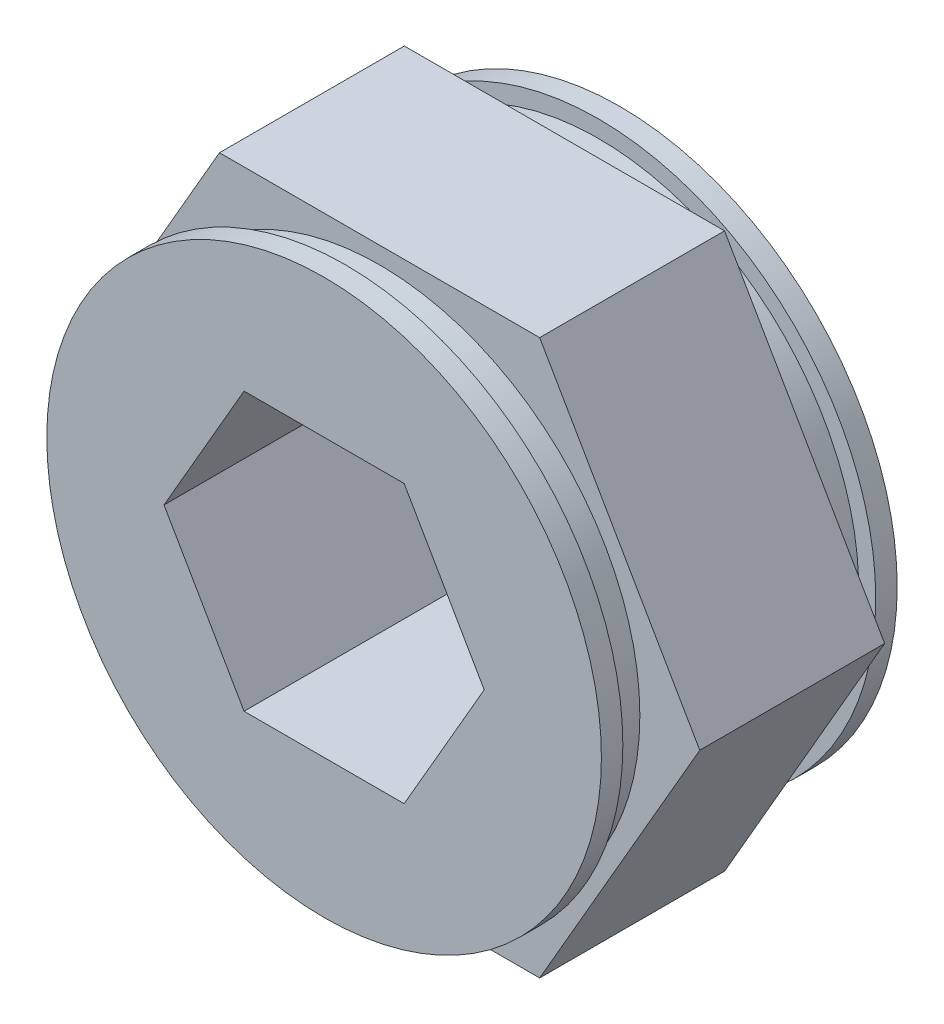
ISO-10303-21;
HEADER;
FILE_DESCRIPTION(('STEP AP214'),'2;1');
FILE_NAME('part.step','',(''),(''),'','','');
FILE_SCHEMA(('AUTOMOTIVE_DESIGN { 1 0 10303 214 1 1 1 1 }'));
ENDSEC;
DATA;
#1=APPLICATION_CONTEXT('core data for automotive mechanical design processes');
#2=APPLICATION_PROTOCOL_DEFINITION('international standard','automotive_design',2000,#1);
#3=PRODUCT_CONTEXT('',#1,'mechanical');
#4=PRODUCT('Part','Part','',(#3));
#5=PRODUCT_RELATED_PRODUCT_CATEGORY('part','',(#4));
#6=PRODUCT_DEFINITION_FORMATION('','',#4);
#7=PRODUCT_DEFINITION_CONTEXT('part definition',#1,'design');
#8=PRODUCT_DEFINITION('design','',#6,#7);
#9=PRODUCT_DEFINITION_SHAPE('','',#8);
#10=(LENGTH_UNIT() NAMED_UNIT(*) SI_UNIT(.MILLI.,.METRE.));
#11=(NAMED_UNIT(*) PLANE_ANGLE_UNIT() SI_UNIT($,.RADIAN.));
#12=(NAMED_UNIT(*) SI_UNIT($,.STERADIAN.) SOLID_ANGLE_UNIT());
#13=UNCERTAINTY_MEASURE_WITH_UNIT(LENGTH_MEASURE(1.E-05),#10,'distance_accuracy_value','');
#14=(GEOMETRIC_REPRESENTATION_CONTEXT(3) GLOBAL_UNCERTAINTY_ASSIGNED_CONTEXT((#13)) GLOBAL_UNIT_ASSIGNED_CONTEXT((#10,
#11,#12)) REPRESENTATION_CONTEXT('',''));
#15=CARTESIAN_POINT('',(0.,0.,0.));
#16=DIRECTION('',(0.,0.,1.));
#17=DIRECTION('',(1.,0.,0.));
#18=AXIS2_PLACEMENT_3D('',#15,#16,#17);
#19=CARTESIAN_POINT('',(0.,0.,0.));
#20=DIRECTION('',(0.,0.,1.));
#21=DIRECTION('',(1.,0.,0.));
#22=AXIS2_PLACEMENT_3D('',#19,#20,#21);
#23=PLANE('',#22);
#24=CARTESIAN_POINT('',(0.,0.,0.));
#25=DIRECTION('',(0.,0.,-1.));
#26=DIRECTION('',(-1.,0.,0.));
#27=AXIS2_PLACEMENT_3D('',#24,#25,#26);
#28=CIRCLE('',#27,8.9408);
#29=CARTESIAN_POINT('',(-8.9408,0.,0.));
#30=VERTEX_POINT('',#29);
#31=EDGE_CURVE('E20',#30,#30,#28,.T.);
#32=ORIENTED_EDGE('',*,*,#31,.F.);
#33=EDGE_LOOP('',(#32));
#34=FACE_BOUND('',#33,.T.);
#35=DIRECTION('',(0.5,0.866025403784438,0.));
#36=VECTOR('',#35,1.);
#37=CARTESIAN_POINT('',(5.49926131403117,-9.525,0.));
#38=LINE('',#37,#36);
#39=CARTESIAN_POINT('',(5.49926131403117,-9.525,0.));
#40=VERTEX_POINT('',#39);
#41=CARTESIAN_POINT('',(10.9985226280624,0.,0.));
#42=VERTEX_POINT('',#41);
#43=EDGE_CURVE('E179',#40,#42,#38,.T.);
#44=ORIENTED_EDGE('',*,*,#43,.F.);
#45=DIRECTION('',(1.,0.,0.));
#46=VECTOR('',#45,1.);
#47=CARTESIAN_POINT('',(-5.49926131403119,-9.525,0.));
#48=LINE('',#47,#46);
#49=CARTESIAN_POINT('',(-5.4992613140312,-9.525,0.));
#50=VERTEX_POINT('',#49);
#51=EDGE_CURVE('E184',#50,#40,#48,.T.);
#52=ORIENTED_EDGE('',*,*,#51,.F.);
#53=DIRECTION('',(0.5,-0.866025403784439,0.));
#54=VECTOR('',#53,1.);
#55=CARTESIAN_POINT('',(-10.9985226280624,0.,0.));
#56=LINE('',#55,#54);
#57=CARTESIAN_POINT('',(-10.9985226280624,0.,0.));
#58=VERTEX_POINT('',#57);
#59=EDGE_CURVE('E190',#58,#50,#56,.T.);
#60=ORIENTED_EDGE('',*,*,#59,.F.);
#61=DIRECTION('',(-0.5,-0.866025403784439,0.));
#62=VECTOR('',#61,1.);
#63=CARTESIAN_POINT('',(-5.49926131403119,9.525,0.));
#64=LINE('',#63,#62);
#65=CARTESIAN_POINT('',(-5.49926131403119,9.525,0.));
#66=VERTEX_POINT('',#65);
#67=EDGE_CURVE('E104',#66,#58,#64,.T.);
#68=ORIENTED_EDGE('',*,*,#67,.F.);
#69=DIRECTION('',(1.,0.,0.));
#70=VECTOR('',#69,1.);
#71=CARTESIAN_POINT('',(5.49926131403117,9.525,0.));
#72=LINE('',#71,#70);
#73=CARTESIAN_POINT('',(5.49926131403117,9.525,0.));
#74=VERTEX_POINT('',#73);
#75=EDGE_CURVE('E106',#74,#66,#72,.F.);
#76=ORIENTED_EDGE('',*,*,#75,.F.);
#77=DIRECTION('',(-0.5,0.866025403784439,0.));
#78=VECTOR('',#77,1.);
#79=CARTESIAN_POINT('',(10.9985226280624,0.,0.));
#80=LINE('',#79,#78);
#81=EDGE_CURVE('E108',#42,#74,#80,.T.);
#82=ORIENTED_EDGE('',*,*,#81,.F.);
#83=EDGE_LOOP('',(#44,#52,#60,#68,#76,#82));
#84=FACE_BOUND('',#83,.T.);
#85=ADVANCED_FACE('F17',(#34,#84),#23,.F.);
#86=CARTESIAN_POINT('',(10.9985226280624,0.,0.));
#87=DIRECTION('',(0.866025403784439,0.5,0.));
#88=DIRECTION('',(-0.5,0.866025403784439,0.));
#89=AXIS2_PLACEMENT_3D('',#86,#87,#88);
#90=PLANE('',#89);
#91=DIRECTION('',(-0.500000000000001,0.866025403784438,0.));
#92=VECTOR('',#91,1.);
#93=CARTESIAN_POINT('',(10.9985226280624,0.,6.35));
#94=LINE('',#93,#92);
#95=CARTESIAN_POINT('',(10.9985226280624,0.,6.35));
#96=VERTEX_POINT('',#95);
#97=CARTESIAN_POINT('',(5.49926131403117,9.525,6.35));
#98=VERTEX_POINT('',#97);
#99=EDGE_CURVE('E173',#96,#98,#94,.T.);
#100=ORIENTED_EDGE('',*,*,#99,.F.);
#101=DIRECTION('',(0.,0.,1.));
#102=VECTOR('',#101,1.);
#103=CARTESIAN_POINT('',(10.9985226280624,0.,0.));
#104=LINE('',#103,#102);
#105=EDGE_CURVE('E119',#42,#96,#104,.T.);
#106=ORIENTED_EDGE('',*,*,#105,.F.);
#107=ORIENTED_EDGE('',*,*,#81,.T.);
#108=DIRECTION('',(0.,0.,1.));
#109=VECTOR('',#108,1.);
#110=CARTESIAN_POINT('',(5.49926131403117,9.525,0.));
#111=LINE('',#110,#109);
#112=EDGE_CURVE('E113',#98,#74,#111,.F.);
#113=ORIENTED_EDGE('',*,*,#112,.F.);
#114=EDGE_LOOP('',(#100,#106,#107,#113));
#115=FACE_BOUND('',#114,.T.);
#116=ADVANCED_FACE('F116',(#115),#90,.T.);
#117=CARTESIAN_POINT('',(5.49926131403117,9.525,0.));
#118=DIRECTION('',(0.,1.,0.));
#119=DIRECTION('',(0.,0.,1.));
#120=AXIS2_PLACEMENT_3D('',#117,#118,#119);
#121=PLANE('',#120);
#122=DIRECTION('',(1.,0.,0.));
#123=VECTOR('',#122,1.);
#124=CARTESIAN_POINT('',(0.,9.525,6.35));
#125=LINE('',#124,#123);
#126=CARTESIAN_POINT('',(-5.49926131403119,9.525,6.35));
#127=VERTEX_POINT('',#126);
#128=EDGE_CURVE('E124',#98,#127,#125,.F.);
#129=ORIENTED_EDGE('',*,*,#128,.F.);
#130=ORIENTED_EDGE('',*,*,#112,.T.);
#131=ORIENTED_EDGE('',*,*,#75,.T.);
#132=DIRECTION('',(0.,0.,1.));
#133=VECTOR('',#132,1.);
#134=CARTESIAN_POINT('',(-5.49926131403119,9.525,0.));
#135=LINE('',#134,#133);
#136=EDGE_CURVE('E127',#127,#66,#135,.F.);
#137=ORIENTED_EDGE('',*,*,#136,.F.);
#138=EDGE_LOOP('',(#129,#130,#131,#137));
#139=FACE_BOUND('',#138,.T.);
#140=ADVANCED_FACE('F122',(#139),#121,.T.);
#141=CARTESIAN_POINT('',(-5.49926131403119,9.525,0.));
#142=DIRECTION('',(-0.866025403784439,0.5,0.));
#143=DIRECTION('',(-0.5,-0.866025403784439,0.));
#144=AXIS2_PLACEMENT_3D('',#141,#142,#143);
#145=PLANE('',#144);
#146=DIRECTION('',(-0.500000000000001,-0.866025403784438,0.));
#147=VECTOR('',#146,1.);
#148=CARTESIAN_POINT('',(-5.49926131403119,9.525,6.35));
#149=LINE('',#148,#147);
#150=CARTESIAN_POINT('',(-10.9985226280624,0.,6.35));
#151=VERTEX_POINT('',#150);
#152=EDGE_CURVE('E169',#127,#151,#149,.T.);
#153=ORIENTED_EDGE('',*,*,#152,.F.);
#154=ORIENTED_EDGE('',*,*,#136,.T.);
#155=ORIENTED_EDGE('',*,*,#67,.T.);
#156=DIRECTION('',(0.,0.,1.));
#157=VECTOR('',#156,1.);
#158=CARTESIAN_POINT('',(-10.9985226280624,0.,0.));
#159=LINE('',#158,#157);
#160=EDGE_CURVE('E187',#151,#58,#159,.F.);
#161=ORIENTED_EDGE('',*,*,#160,.F.);
#162=EDGE_LOOP('',(#153,#154,#155,#161));
#163=FACE_BOUND('',#162,.T.);
#164=ADVANCED_FACE('F194',(#163),#145,.T.);
#165=CARTESIAN_POINT('',(-10.9985226280624,0.,0.));
#166=DIRECTION('',(-0.866025403784439,-0.5,0.));
#167=DIRECTION('',(0.5,-0.866025403784439,0.));
#168=AXIS2_PLACEMENT_3D('',#165,#166,#167);
#169=PLANE('',#168);
#170=DIRECTION('',(0.5,-0.866025403784438,0.));
#171=VECTOR('',#170,1.);
#172=CARTESIAN_POINT('',(-10.9985226280624,0.,6.35));
#173=LINE('',#172,#171);
#174=CARTESIAN_POINT('',(-5.4992613140312,-9.525,6.35));
#175=VERTEX_POINT('',#174);
#176=EDGE_CURVE('E162',#151,#175,#173,.T.);
#177=ORIENTED_EDGE('',*,*,#176,.F.);
#178=ORIENTED_EDGE('',*,*,#160,.T.);
#179=ORIENTED_EDGE('',*,*,#59,.T.);
#180=DIRECTION('',(0.,0.,-1.));
#181=VECTOR('',#180,1.);
#182=CARTESIAN_POINT('',(-5.49926131403119,-9.525,0.));
#183=LINE('',#182,#181);
#184=EDGE_CURVE('E181',#175,#50,#183,.T.);
#185=ORIENTED_EDGE('',*,*,#184,.F.);
#186=EDGE_LOOP('',(#177,#178,#179,#185));
#187=FACE_BOUND('',#186,.T.);
#188=ADVANCED_FACE('F203',(#187),#169,.T.);
#189=CARTESIAN_POINT('',(-5.49926131403119,-9.525,0.));
#190=DIRECTION('',(0.,-1.,0.));
#191=DIRECTION('',(0.,0.,-1.));
#192=AXIS2_PLACEMENT_3D('',#189,#190,#191);
#193=PLANE('',#192);
#194=DIRECTION('',(1.,0.,0.));
#195=VECTOR('',#194,1.);
#196=CARTESIAN_POINT('',(0.,-9.525,6.35));
#197=LINE('',#196,#195);
#198=CARTESIAN_POINT('',(5.49926131403117,-9.525,6.35));
#199=VERTEX_POINT('',#198);
#200=EDGE_CURVE('E157',#175,#199,#197,.T.);
#201=ORIENTED_EDGE('',*,*,#200,.F.);
#202=ORIENTED_EDGE('',*,*,#184,.T.);
#203=ORIENTED_EDGE('',*,*,#51,.T.);
#204=DIRECTION('',(0.,0.,1.));
#205=VECTOR('',#204,1.);
#206=CARTESIAN_POINT('',(5.49926131403117,-9.525,0.));
#207=LINE('',#206,#205);
#208=EDGE_CURVE('E175',#199,#40,#207,.F.);
#209=ORIENTED_EDGE('',*,*,#208,.F.);
#210=EDGE_LOOP('',(#201,#202,#203,#209));
#211=FACE_BOUND('',#210,.T.);
#212=ADVANCED_FACE('F201',(#211),#193,.T.);
#213=CARTESIAN_POINT('',(5.49926131403117,-9.525,0.));
#214=DIRECTION('',(0.866025403784438,-0.5,0.));
#215=DIRECTION('',(0.5,0.866025403784438,0.));
#216=AXIS2_PLACEMENT_3D('',#213,#214,#215);
#217=PLANE('',#216);
#218=DIRECTION('',(0.500000000000001,0.866025403784438,0.));
#219=VECTOR('',#218,1.);
#220=CARTESIAN_POINT('',(5.49926131403117,-9.525,6.35));
#221=LINE('',#220,#219);
#222=EDGE_CURVE('E153',#199,#96,#221,.T.);
#223=ORIENTED_EDGE('',*,*,#222,.F.);
#224=ORIENTED_EDGE('',*,*,#208,.T.);
#225=ORIENTED_EDGE('',*,*,#43,.T.);
#226=ORIENTED_EDGE('',*,*,#105,.T.);
#227=EDGE_LOOP('',(#223,#224,#225,#226));
#228=FACE_BOUND('',#227,.T.);
#229=ADVANCED_FACE('F198',(#228),#217,.T.);
#230=CARTESIAN_POINT('',(0.,0.,0.));
#231=DIRECTION('',(0.,0.,-1.));
#232=DIRECTION('',(-1.,0.,0.));
#233=AXIS2_PLACEMENT_3D('',#230,#231,#232);
#234=CYLINDRICAL_SURFACE('',#233,8.9408);
#235=ORIENTED_EDGE('',*,*,#31,.T.);
#236=EDGE_LOOP('',(#235));
#237=FACE_BOUND('',#236,.T.);
#238=CARTESIAN_POINT('',(0.,0.,-1.1684));
#239=DIRECTION('',(0.,0.,-1.));
#240=DIRECTION('',(-1.,0.,0.));
#241=AXIS2_PLACEMENT_3D('',#238,#239,#240);
#242=CIRCLE('',#241,8.9408);
#243=CARTESIAN_POINT('',(-8.9408,0.,-1.1684));
#244=VERTEX_POINT('',#243);
#245=EDGE_CURVE('E151',#244,#244,#242,.T.);
#246=ORIENTED_EDGE('',*,*,#245,.F.);
#247=EDGE_LOOP('',(#246));
#248=FACE_BOUND('',#247,.T.);
#249=ADVANCED_FACE('F270',(#237,#248),#234,.T.);
#250=CARTESIAN_POINT('',(0.,0.,6.35));
#251=DIRECTION('',(0.,0.,1.));
#252=DIRECTION('',(1.,0.,0.));
#253=AXIS2_PLACEMENT_3D('',#250,#251,#252);
#254=PLANE('',#253);
#255=CARTESIAN_POINT('',(0.,0.,6.35));
#256=DIRECTION('',(0.,0.,1.));
#257=DIRECTION('',(1.,0.,0.));
#258=AXIS2_PLACEMENT_3D('',#255,#256,#257);
#259=CIRCLE('',#258,8.9408);
#260=CARTESIAN_POINT('',(8.9408,0.,6.35));
#261=VERTEX_POINT('',#260);
#262=EDGE_CURVE('E149',#261,#261,#259,.T.);
#263=ORIENTED_EDGE('',*,*,#262,.F.);
#264=EDGE_LOOP('',(#263));
#265=FACE_BOUND('',#264,.T.);
#266=ORIENTED_EDGE('',*,*,#200,.T.);
#267=ORIENTED_EDGE('',*,*,#222,.T.);
#268=ORIENTED_EDGE('',*,*,#99,.T.);
#269=ORIENTED_EDGE('',*,*,#128,.T.);
#270=ORIENTED_EDGE('',*,*,#152,.T.);
#271=ORIENTED_EDGE('',*,*,#176,.T.);
#272=EDGE_LOOP('',(#266,#267,#268,#269,#270,#271));
#273=FACE_BOUND('',#272,.T.);
#274=ADVANCED_FACE('F196',(#265,#273),#254,.T.);
#275=CARTESIAN_POINT('',(0.,0.,-1.1684));
#276=DIRECTION('',(0.,0.,1.));
#277=DIRECTION('',(1.,0.,0.));
#278=AXIS2_PLACEMENT_3D('',#275,#276,#277);
#279=PLANE('',#278);
#280=ORIENTED_EDGE('',*,*,#245,.T.);
#281=EDGE_LOOP('',(#280));
#282=FACE_BOUND('',#281,.T.);
#283=CARTESIAN_POINT('',(0.,0.,-1.1684));
#284=DIRECTION('',(0.,0.,-1.));
#285=DIRECTION('',(-1.,0.,0.));
#286=AXIS2_PLACEMENT_3D('',#283,#284,#285);
#287=CIRCLE('',#286,9.525);
#288=CARTESIAN_POINT('',(-9.525,0.,-1.1684));
#289=VERTEX_POINT('',#288);
#290=EDGE_CURVE('E146',#289,#289,#287,.T.);
#291=ORIENTED_EDGE('',*,*,#290,.F.);
#292=EDGE_LOOP('',(#291));
#293=FACE_BOUND('',#292,.T.);
#294=ADVANCED_FACE('F264',(#282,#293),#279,.T.);
#295=CARTESIAN_POINT('',(0.,0.,6.35));
#296=DIRECTION('',(0.,0.,1.));
#297=DIRECTION('',(1.,0.,0.));
#298=AXIS2_PLACEMENT_3D('',#295,#296,#297);
#299=CYLINDRICAL_SURFACE('',#298,8.9408);
#300=ORIENTED_EDGE('',*,*,#262,.T.);
#301=EDGE_LOOP('',(#300));
#302=FACE_BOUND('',#301,.T.);
#303=CARTESIAN_POINT('',(0.,0.,7.5184));
#304=DIRECTION('',(0.,0.,1.));
#305=DIRECTION('',(1.,0.,0.));
#306=AXIS2_PLACEMENT_3D('',#303,#304,#305);
#307=CIRCLE('',#306,8.9408);
#308=CARTESIAN_POINT('',(8.9408,0.,7.5184));
#309=VERTEX_POINT('',#308);
#310=EDGE_CURVE('E143',#309,#309,#307,.F.);
#311=ORIENTED_EDGE('',*,*,#310,.T.);
#312=EDGE_LOOP('',(#311));
#313=FACE_BOUND('',#312,.T.);
#314=ADVANCED_FACE('F260',(#302,#313),#299,.T.);
#315=CARTESIAN_POINT('',(0.,0.,-1.1684));
#316=DIRECTION('',(0.,0.,-1.));
#317=DIRECTION('',(-1.,0.,0.));
#318=AXIS2_PLACEMENT_3D('',#315,#316,#317);
#319=CYLINDRICAL_SURFACE('',#318,9.525);
#320=ORIENTED_EDGE('',*,*,#290,.T.);
#321=EDGE_LOOP('',(#320));
#322=FACE_BOUND('',#321,.T.);
#323=CARTESIAN_POINT('',(0.,0.,-1.905));
#324=DIRECTION('',(0.,0.,-1.));
#325=DIRECTION('',(-1.,0.,0.));
#326=AXIS2_PLACEMENT_3D('',#323,#324,#325);
#327=CIRCLE('',#326,9.525);
#328=CARTESIAN_POINT('',(-9.525,0.,-1.905));
#329=VERTEX_POINT('',#328);
#330=EDGE_CURVE('E140',#329,#329,#327,.F.);
#331=ORIENTED_EDGE('',*,*,#330,.T.);
#332=EDGE_LOOP('',(#331));
#333=FACE_BOUND('',#332,.T.);
#334=ADVANCED_FACE('F256',(#322,#333),#319,.T.);
#335=CARTESIAN_POINT('',(0.,0.,7.5184));
#336=DIRECTION('',(0.,0.,1.));
#337=DIRECTION('',(1.,0.,0.));
#338=AXIS2_PLACEMENT_3D('',#335,#336,#337);
#339=PLANE('',#338);
#340=ORIENTED_EDGE('',*,*,#310,.F.);
#341=EDGE_LOOP('',(#340));
#342=FACE_BOUND('',#341,.T.);
#343=CARTESIAN_POINT('',(0.,0.,7.5184));
#344=DIRECTION('',(0.,0.,1.));
#345=DIRECTION('',(1.,0.,0.));
#346=AXIS2_PLACEMENT_3D('',#343,#344,#345);
#347=CIRCLE('',#346,9.525);
#348=CARTESIAN_POINT('',(9.525,0.,7.5184));
#349=VERTEX_POINT('',#348);
#350=EDGE_CURVE('E136',#349,#349,#347,.T.);
#351=ORIENTED_EDGE('',*,*,#350,.F.);
#352=EDGE_LOOP('',(#351));
#353=FACE_BOUND('',#352,.T.);
#354=ADVANCED_FACE('F252',(#342,#353),#339,.F.);
#355=CARTESIAN_POINT('',(0.,0.,-1.905));
#356=DIRECTION('',(0.,0.,1.));
#357=DIRECTION('',(1.,0.,0.));
#358=AXIS2_PLACEMENT_3D('',#355,#356,#357);
#359=PLANE('',#358);
#360=DIRECTION('',(-0.5,-0.866025403784438,0.));
#361=VECTOR('',#360,1.);
#362=CARTESIAN_POINT('',(-2.7496306570156,4.7625,-1.905));
#363=LINE('',#362,#361);
#364=CARTESIAN_POINT('',(-2.7496306570156,4.7625,-1.905));
#365=VERTEX_POINT('',#364);
#366=CARTESIAN_POINT('',(-5.49926131403119,0.,-1.905));
#367=VERTEX_POINT('',#366);
#368=EDGE_CURVE('E386',#365,#367,#363,.T.);
#369=ORIENTED_EDGE('',*,*,#368,.T.);
#370=DIRECTION('',(0.5,-0.866025403784439,0.));
#371=VECTOR('',#370,1.);
#372=CARTESIAN_POINT('',(-5.49926131403119,0.,-1.905));
#373=LINE('',#372,#371);
#374=CARTESIAN_POINT('',(-2.7496306570156,-4.7625,-1.905));
#375=VERTEX_POINT('',#374);
#376=EDGE_CURVE('E139',#367,#375,#373,.T.);
#377=ORIENTED_EDGE('',*,*,#376,.T.);
#378=DIRECTION('',(1.,0.,0.));
#379=VECTOR('',#378,1.);
#380=CARTESIAN_POINT('',(-2.7496306570156,-4.7625,-1.905));
#381=LINE('',#380,#379);
#382=CARTESIAN_POINT('',(2.7496306570156,-4.7625,-1.905));
#383=VERTEX_POINT('',#382);
#384=EDGE_CURVE('E413',#375,#383,#381,.T.);
#385=ORIENTED_EDGE('',*,*,#384,.T.);
#386=DIRECTION('',(0.500000000000001,0.866025403784438,0.));
#387=VECTOR('',#386,1.);
#388=CARTESIAN_POINT('',(2.7496306570156,-4.7625,-1.905));
#389=LINE('',#388,#387);
#390=CARTESIAN_POINT('',(5.4992613140312,0.,-1.905));
#391=VERTEX_POINT('',#390);
#392=EDGE_CURVE('E409',#383,#391,#389,.T.);
#393=ORIENTED_EDGE('',*,*,#392,.T.);
#394=DIRECTION('',(-0.5,0.866025403784439,0.));
#395=VECTOR('',#394,1.);
#396=CARTESIAN_POINT('',(5.49926131403119,0.,-1.905));
#397=LINE('',#396,#395);
#398=CARTESIAN_POINT('',(2.7496306570156,4.7625,-1.905));
#399=VERTEX_POINT('',#398);
#400=EDGE_CURVE('E405',#391,#399,#397,.T.);
#401=ORIENTED_EDGE('',*,*,#400,.T.);
#402=DIRECTION('',(1.,0.,0.));
#403=VECTOR('',#402,1.);
#404=CARTESIAN_POINT('',(2.7496306570156,4.7625,-1.905));
#405=LINE('',#404,#403);
#406=EDGE_CURVE('E390',#399,#365,#405,.F.);
#407=ORIENTED_EDGE('',*,*,#406,.T.);
#408=EDGE_LOOP('',(#369,#377,#385,#393,#401,#407));
#409=FACE_BOUND('',#408,.T.);
#410=ORIENTED_EDGE('',*,*,#330,.F.);
#411=EDGE_LOOP('',(#410));
#412=FACE_BOUND('',#411,.T.);
#413=ADVANCED_FACE('F248',(#409,#412),#359,.F.);
#414=CARTESIAN_POINT('',(0.,0.,7.5184));
#415=DIRECTION('',(0.,0.,1.));
#416=DIRECTION('',(1.,0.,0.));
#417=AXIS2_PLACEMENT_3D('',#414,#415,#416);
#418=CYLINDRICAL_SURFACE('',#417,9.525);
#419=ORIENTED_EDGE('',*,*,#350,.T.);
#420=EDGE_LOOP('',(#419));
#421=FACE_BOUND('',#420,.T.);
#422=CARTESIAN_POINT('',(0.,0.,8.255));
#423=DIRECTION('',(0.,0.,1.));
#424=DIRECTION('',(1.,0.,0.));
#425=AXIS2_PLACEMENT_3D('',#422,#423,#424);
#426=CIRCLE('',#425,9.525);
#427=CARTESIAN_POINT('',(9.525,0.,8.255));
#428=VERTEX_POINT('',#427);
#429=EDGE_CURVE('E131',#428,#428,#426,.T.);
#430=ORIENTED_EDGE('',*,*,#429,.F.);
#431=EDGE_LOOP('',(#430));
#432=FACE_BOUND('',#431,.T.);
#433=ADVANCED_FACE('F244',(#421,#432),#418,.T.);
#434=CARTESIAN_POINT('',(-5.49926131403119,0.,0.));
#435=DIRECTION('',(-0.866025403784439,-0.5,0.));
#436=DIRECTION('',(0.5,-0.866025403784439,0.));
#437=AXIS2_PLACEMENT_3D('',#434,#435,#436);
#438=PLANE('',#437);
#439=DIRECTION('',(-0.5,0.866025403784438,0.));
#440=VECTOR('',#439,1.);
#441=CARTESIAN_POINT('',(-2.7496306570156,-4.7625,8.255));
#442=LINE('',#441,#440);
#443=CARTESIAN_POINT('',(-2.7496306570156,-4.7625,8.255));
#444=VERTEX_POINT('',#443);
#445=CARTESIAN_POINT('',(-5.49926131403119,0.,8.25500000000001));
#446=VERTEX_POINT('',#445);
#447=EDGE_CURVE('E134',#444,#446,#442,.T.);
#448=ORIENTED_EDGE('',*,*,#447,.F.);
#449=DIRECTION('',(0.,0.,-1.));
#450=VECTOR('',#449,1.);
#451=CARTESIAN_POINT('',(-2.7496306570156,-4.7625,0.));
#452=LINE('',#451,#450);
#453=EDGE_CURVE('E135',#444,#375,#452,.T.);
#454=ORIENTED_EDGE('',*,*,#453,.T.);
#455=ORIENTED_EDGE('',*,*,#376,.F.);
#456=DIRECTION('',(0.,0.,1.));
#457=VECTOR('',#456,1.);
#458=CARTESIAN_POINT('',(-5.49926131403119,0.,0.));
#459=LINE('',#458,#457);
#460=EDGE_CURVE('E393',#367,#446,#459,.T.);
#461=ORIENTED_EDGE('',*,*,#460,.T.);
#462=EDGE_LOOP('',(#448,#454,#455,#461));
#463=FACE_BOUND('',#462,.T.);
#464=ADVANCED_FACE('F240',(#463),#438,.F.);
#465=CARTESIAN_POINT('',(-2.7496306570156,4.7625,0.));
#466=DIRECTION('',(-0.866025403784438,0.5,0.));
#467=DIRECTION('',(-0.5,-0.866025403784438,0.));
#468=AXIS2_PLACEMENT_3D('',#465,#466,#467);
#469=PLANE('',#468);
#470=DIRECTION('',(0.500000000000001,0.866025403784438,0.));
#471=VECTOR('',#470,1.);
#472=CARTESIAN_POINT('',(-5.49926131403119,0.,8.255));
#473=LINE('',#472,#471);
#474=CARTESIAN_POINT('',(-2.7496306570156,4.7625,8.255));
#475=VERTEX_POINT('',#474);
#476=EDGE_CURVE('E398',#446,#475,#473,.T.);
#477=ORIENTED_EDGE('',*,*,#476,.F.);
#478=ORIENTED_EDGE('',*,*,#460,.F.);
#479=ORIENTED_EDGE('',*,*,#368,.F.);
#480=DIRECTION('',(0.,0.,1.));
#481=VECTOR('',#480,1.);
#482=CARTESIAN_POINT('',(-2.7496306570156,4.7625,0.));
#483=LINE('',#482,#481);
#484=EDGE_CURVE('E401',#365,#475,#483,.T.);
#485=ORIENTED_EDGE('',*,*,#484,.T.);
#486=EDGE_LOOP('',(#477,#478,#479,#485));
#487=FACE_BOUND('',#486,.T.);
#488=ADVANCED_FACE('F236',(#487),#469,.F.);
#489=CARTESIAN_POINT('',(2.7496306570156,4.7625,0.));
#490=DIRECTION('',(0.,1.,0.));
#491=DIRECTION('',(0.,0.,1.));
#492=AXIS2_PLACEMENT_3D('',#489,#490,#491);
#493=PLANE('',#492);
#494=DIRECTION('',(1.,0.,0.));
#495=VECTOR('',#494,1.);
#496=CARTESIAN_POINT('',(0.,4.7625,8.255));
#497=LINE('',#496,#495);
#498=CARTESIAN_POINT('',(2.7496306570156,4.7625,8.255));
#499=VERTEX_POINT('',#498);
#500=EDGE_CURVE('E419',#475,#499,#497,.T.);
#501=ORIENTED_EDGE('',*,*,#500,.F.);
#502=ORIENTED_EDGE('',*,*,#484,.F.);
#503=ORIENTED_EDGE('',*,*,#406,.F.);
#504=DIRECTION('',(0.,0.,1.));
#505=VECTOR('',#504,1.);
#506=CARTESIAN_POINT('',(2.7496306570156,4.7625,0.));
#507=LINE('',#506,#505);
#508=EDGE_CURVE('E407',#399,#499,#507,.T.);
#509=ORIENTED_EDGE('',*,*,#508,.T.);
#510=EDGE_LOOP('',(#501,#502,#503,#509));
#511=FACE_BOUND('',#510,.T.);
#512=ADVANCED_FACE('F232',(#511),#493,.F.);
#513=CARTESIAN_POINT('',(5.49926131403119,0.,0.));
#514=DIRECTION('',(0.866025403784439,0.5,0.));
#515=DIRECTION('',(-0.5,0.866025403784439,0.));
#516=AXIS2_PLACEMENT_3D('',#513,#514,#515);
#517=PLANE('',#516);
#518=DIRECTION('',(0.5,-0.866025403784438,0.));
#519=VECTOR('',#518,1.);
#520=CARTESIAN_POINT('',(2.7496306570156,4.7625,8.255));
#521=LINE('',#520,#519);
#522=CARTESIAN_POINT('',(5.4992613140312,0.,8.25500000000001));
#523=VERTEX_POINT('',#522);
#524=EDGE_CURVE('E422',#499,#523,#521,.T.);
#525=ORIENTED_EDGE('',*,*,#524,.F.);
#526=ORIENTED_EDGE('',*,*,#508,.F.);
#527=ORIENTED_EDGE('',*,*,#400,.F.);
#528=DIRECTION('',(0.,0.,1.));
#529=VECTOR('',#528,1.);
#530=CARTESIAN_POINT('',(5.4992613140312,0.,0.));
#531=LINE('',#530,#529);
#532=EDGE_CURVE('E411',#391,#523,#531,.T.);
#533=ORIENTED_EDGE('',*,*,#532,.T.);
#534=EDGE_LOOP('',(#525,#526,#527,#533));
#535=FACE_BOUND('',#534,.T.);
#536=ADVANCED_FACE('F229',(#535),#517,.F.);
#537=CARTESIAN_POINT('',(2.7496306570156,-4.7625,0.));
#538=DIRECTION('',(0.866025403784438,-0.500000000000001,0.));
#539=DIRECTION('',(0.500000000000001,0.866025403784438,0.));
#540=AXIS2_PLACEMENT_3D('',#537,#538,#539);
#541=PLANE('',#540);
#542=DIRECTION('',(-0.500000000000001,-0.866025403784438,0.));
#543=VECTOR('',#542,1.);
#544=CARTESIAN_POINT('',(5.49926131403119,0.,8.255));
#545=LINE('',#544,#543);
#546=CARTESIAN_POINT('',(2.7496306570156,-4.7625,8.255));
#547=VERTEX_POINT('',#546);
#548=EDGE_CURVE('E26',#523,#547,#545,.T.);
#549=ORIENTED_EDGE('',*,*,#548,.F.);
#550=ORIENTED_EDGE('',*,*,#532,.F.);
#551=ORIENTED_EDGE('',*,*,#392,.F.);
#552=DIRECTION('',(0.,0.,-1.));
#553=VECTOR('',#552,1.);
#554=CARTESIAN_POINT('',(2.7496306570156,-4.7625,0.));
#555=LINE('',#554,#553);
#556=EDGE_CURVE('E35',#383,#547,#555,.F.);
#557=ORIENTED_EDGE('',*,*,#556,.T.);
#558=EDGE_LOOP('',(#549,#550,#551,#557));
#559=FACE_BOUND('',#558,.T.);
#560=ADVANCED_FACE('F221',(#559),#541,.F.);
#561=CARTESIAN_POINT('',(-2.7496306570156,-4.7625,0.));
#562=DIRECTION('',(0.,-1.,0.));
#563=DIRECTION('',(0.,0.,-1.));
#564=AXIS2_PLACEMENT_3D('',#561,#562,#563);
#565=PLANE('',#564);
#566=DIRECTION('',(1.,0.,0.));
#567=VECTOR('',#566,1.);
#568=CARTESIAN_POINT('',(0.,-4.7625,8.255));
#569=LINE('',#568,#567);
#570=EDGE_CURVE('E11',#547,#444,#569,.F.);
#571=ORIENTED_EDGE('',*,*,#570,.F.);
#572=ORIENTED_EDGE('',*,*,#556,.F.);
#573=ORIENTED_EDGE('',*,*,#384,.F.);
#574=ORIENTED_EDGE('',*,*,#453,.F.);
#575=EDGE_LOOP('',(#571,#572,#573,#574));
#576=FACE_BOUND('',#575,.T.);
#577=ADVANCED_FACE('F215',(#576),#565,.F.);
#578=CARTESIAN_POINT('',(0.,0.,8.255));
#579=DIRECTION('',(0.,0.,1.));
#580=DIRECTION('',(1.,0.,0.));
#581=AXIS2_PLACEMENT_3D('',#578,#579,#580);
#582=PLANE('',#581);
#583=ORIENTED_EDGE('',*,*,#548,.T.);
#584=ORIENTED_EDGE('',*,*,#570,.T.);
#585=ORIENTED_EDGE('',*,*,#447,.T.);
#586=ORIENTED_EDGE('',*,*,#476,.T.);
#587=ORIENTED_EDGE('',*,*,#500,.T.);
#588=ORIENTED_EDGE('',*,*,#524,.T.);
#589=EDGE_LOOP('',(#583,#584,#585,#586,#587,#588));
#590=FACE_BOUND('',#589,.T.);
#591=ORIENTED_EDGE('',*,*,#429,.T.);
#592=EDGE_LOOP('',(#591));
#593=FACE_BOUND('',#592,.T.);
#594=ADVANCED_FACE('F213',(#590,#593),#582,.T.);
#595=CLOSED_SHELL('',(#85,#116,#140,#164,#188,#212,#229,#249,#274,#294,#314,#334,#354,#413,#433,
#464,#488,#512,#536,#560,#577,#594));
#596=MANIFOLD_SOLID_BREP('B1',#595);
#597=ADVANCED_BREP_SHAPE_REPRESENTATION('',(#18,#596),#14);
#598=SHAPE_DEFINITION_REPRESENTATION(#9,#597);
ENDSEC;
END-ISO-10303-21;
